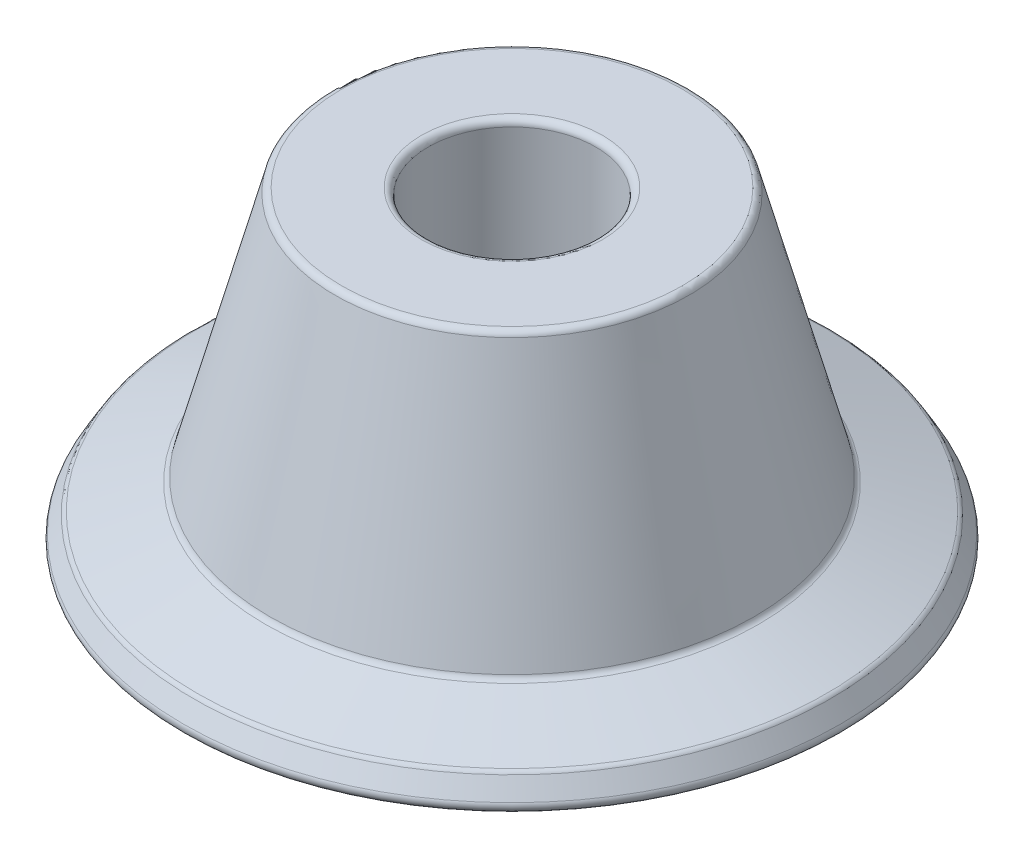
ISO-10303-21;
HEADER;
FILE_DESCRIPTION(('STEP AP214'),'2;1');
FILE_NAME('part.step','',(''),(''),'','','');
FILE_SCHEMA(('AUTOMOTIVE_DESIGN { 1 0 10303 214 1 1 1 1 }'));
ENDSEC;
DATA;
#1=APPLICATION_CONTEXT('core data for automotive mechanical design processes');
#2=APPLICATION_PROTOCOL_DEFINITION('international standard','automotive_design',2000,#1);
#3=PRODUCT_CONTEXT('',#1,'mechanical');
#4=PRODUCT('Part','Part','',(#3));
#5=PRODUCT_RELATED_PRODUCT_CATEGORY('part','',(#4));
#6=PRODUCT_DEFINITION_FORMATION('','',#4);
#7=PRODUCT_DEFINITION_CONTEXT('part definition',#1,'design');
#8=PRODUCT_DEFINITION('design','',#6,#7);
#9=PRODUCT_DEFINITION_SHAPE('','',#8);
#10=(LENGTH_UNIT() NAMED_UNIT(*) SI_UNIT(.MILLI.,.METRE.));
#11=(NAMED_UNIT(*) PLANE_ANGLE_UNIT() SI_UNIT($,.RADIAN.));
#12=(NAMED_UNIT(*) SI_UNIT($,.STERADIAN.) SOLID_ANGLE_UNIT());
#13=UNCERTAINTY_MEASURE_WITH_UNIT(LENGTH_MEASURE(1.E-05),#10,'distance_accuracy_value','');
#14=(GEOMETRIC_REPRESENTATION_CONTEXT(3) GLOBAL_UNCERTAINTY_ASSIGNED_CONTEXT((#13)) GLOBAL_UNIT_ASSIGNED_CONTEXT((#10,
#11,#12)) REPRESENTATION_CONTEXT('',''));
#15=CARTESIAN_POINT('',(0.,0.,0.));
#16=DIRECTION('',(0.,0.,1.));
#17=DIRECTION('',(1.,0.,0.));
#18=AXIS2_PLACEMENT_3D('',#15,#16,#17);
#19=CARTESIAN_POINT('',(0.,-2.56687297664551,0.));
#20=DIRECTION('',(0.,-1.,0.));
#21=DIRECTION('',(0.,0.,-1.));
#22=AXIS2_PLACEMENT_3D('',#19,#20,#21);
#23=CONICAL_SURFACE('',#22,17.9329922306617,0.259688319580683);
#24=CARTESIAN_POINT('',(0.,15.6283896672882,0.));
#25=DIRECTION('',(0.,-1.,0.));
#26=DIRECTION('',(0.,0.,-1.));
#27=AXIS2_PLACEMENT_3D('',#24,#25,#26);
#28=CIRCLE('',#27,13.0987323436966);
#29=CARTESIAN_POINT('',(0.,15.6283896672882,-13.0987323436966));
#30=VERTEX_POINT('',#29);
#31=EDGE_CURVE('E166',#30,#30,#28,.F.);
#32=ORIENTED_EDGE('',*,*,#31,.F.);
#33=EDGE_LOOP('',(#32));
#34=FACE_BOUND('',#33,.T.);
#35=CARTESIAN_POINT('',(0.,-2.56687297664552,0.));
#36=DIRECTION('',(0.,-1.,0.));
#37=DIRECTION('',(0.,0.,-1.));
#38=AXIS2_PLACEMENT_3D('',#35,#36,#37);
#39=CIRCLE('',#38,17.9329922306617);
#40=CARTESIAN_POINT('',(0.,-2.56687297664552,-17.9329922306617));
#41=VERTEX_POINT('',#40);
#42=EDGE_CURVE('E171',#41,#41,#39,.F.);
#43=ORIENTED_EDGE('',*,*,#42,.T.);
#44=EDGE_LOOP('',(#43));
#45=FACE_BOUND('',#44,.T.);
#46=ADVANCED_FACE('F16',(#34,#45),#23,.T.);
#47=CARTESIAN_POINT('',(0.,-2.43848330935731,0.));
#48=DIRECTION('',(0.,-1.,0.));
#49=DIRECTION('',(0.,0.,-1.));
#50=AXIS2_PLACEMENT_3D('',#47,#48,#49);
#51=TOROIDAL_SURFACE('',#50,18.4162272597455,0.5);
#52=ORIENTED_EDGE('',*,*,#42,.F.);
#53=EDGE_LOOP('',(#52));
#54=FACE_BOUND('',#53,.T.);
#55=CARTESIAN_POINT('',(0.,-2.90832961975026,0.));
#56=DIRECTION('',(0.,-1.,0.));
#57=DIRECTION('',(0.,0.,-1.));
#58=AXIS2_PLACEMENT_3D('',#55,#56,#57);
#59=CIRCLE('',#58,18.2452171880826);
#60=CARTESIAN_POINT('',(0.,-2.90832961975026,-18.2452171880826));
#61=VERTEX_POINT('',#60);
#62=EDGE_CURVE('E66',#61,#61,#59,.T.);
#63=ORIENTED_EDGE('',*,*,#62,.F.);
#64=EDGE_LOOP('',(#63));
#65=FACE_BOUND('',#64,.T.);
#66=ADVANCED_FACE('F154',(#54,#65),#51,.F.);
#67=CARTESIAN_POINT('',(0.,15.5,0.));
#68=DIRECTION('',(0.,-1.,0.));
#69=DIRECTION('',(0.,0.,-1.));
#70=AXIS2_PLACEMENT_3D('',#67,#68,#69);
#71=TOROIDAL_SURFACE('',#70,12.6154973146128,0.5);
#72=CARTESIAN_POINT('',(0.,16.,0.));
#73=DIRECTION('',(0.,-1.,0.));
#74=DIRECTION('',(0.,0.,-1.));
#75=AXIS2_PLACEMENT_3D('',#72,#73,#74);
#76=CIRCLE('',#75,12.6154973146128);
#77=CARTESIAN_POINT('',(0.,16.,-12.6154973146128));
#78=VERTEX_POINT('',#77);
#79=CARTESIAN_POINT('',(0.,16.,12.6154973146128));
#80=VERTEX_POINT('',#79);
#81=EDGE_CURVE('E53',#78,#80,#76,.T.);
#82=ORIENTED_EDGE('',*,*,#81,.T.);
#83=CARTESIAN_POINT('',(0.,16.,0.));
#84=DIRECTION('',(0.,-1.,0.));
#85=DIRECTION('',(0.,0.,1.));
#86=AXIS2_PLACEMENT_3D('',#83,#84,#85);
#87=CIRCLE('',#86,12.6154973146128);
#88=EDGE_CURVE('E56',#80,#78,#87,.T.);
#89=ORIENTED_EDGE('',*,*,#88,.T.);
#90=EDGE_LOOP('',(#82,#89));
#91=FACE_BOUND('',#90,.T.);
#92=ORIENTED_EDGE('',*,*,#31,.T.);
#93=EDGE_LOOP('',(#92));
#94=FACE_BOUND('',#93,.T.);
#95=ADVANCED_FACE('F64',(#91,#94),#71,.T.);
#96=CARTESIAN_POINT('',(0.,-4.76321204202719,0.));
#97=DIRECTION('',(0.,-1.,0.));
#98=DIRECTION('',(0.,0.,-1.));
#99=AXIS2_PLACEMENT_3D('',#96,#97,#98);
#100=CONICAL_SURFACE('',#99,23.3414647590318,1.22173047639603);
#101=ORIENTED_EDGE('',*,*,#62,.T.);
#102=EDGE_LOOP('',(#101));
#103=FACE_BOUND('',#102,.T.);
#104=CARTESIAN_POINT('',(0.,-4.76321204202719,0.));
#105=DIRECTION('',(0.,1.,0.));
#106=DIRECTION('',(0.,0.,1.));
#107=AXIS2_PLACEMENT_3D('',#104,#105,#106);
#108=CIRCLE('',#107,23.3414647590318);
#109=CARTESIAN_POINT('',(0.,-4.76321204202719,23.3414647590318));
#110=VERTEX_POINT('',#109);
#111=EDGE_CURVE('E61',#110,#110,#108,.F.);
#112=ORIENTED_EDGE('',*,*,#111,.F.);
#113=EDGE_LOOP('',(#112));
#114=FACE_BOUND('',#113,.T.);
#115=ADVANCED_FACE('F111',(#103,#114),#100,.T.);
#116=CARTESIAN_POINT('',(0.,16.,0.));
#117=DIRECTION('',(0.,-1.,0.));
#118=DIRECTION('',(0.,0.,-1.));
#119=AXIS2_PLACEMENT_3D('',#116,#117,#118);
#120=PLANE('',#119);
#121=CARTESIAN_POINT('',(0.,16.,0.));
#122=DIRECTION('',(0.,1.,0.));
#123=DIRECTION('',(0.,0.,-1.));
#124=AXIS2_PLACEMENT_3D('',#121,#122,#123);
#125=CIRCLE('',#124,6.7);
#126=CARTESIAN_POINT('',(0.,16.,-6.7));
#127=VERTEX_POINT('',#126);
#128=CARTESIAN_POINT('',(0.,16.,6.7));
#129=VERTEX_POINT('',#128);
#130=EDGE_CURVE('E149',#127,#129,#125,.T.);
#131=ORIENTED_EDGE('',*,*,#130,.F.);
#132=CARTESIAN_POINT('',(0.,16.,0.));
#133=DIRECTION('',(0.,1.,0.));
#134=DIRECTION('',(0.,0.,1.));
#135=AXIS2_PLACEMENT_3D('',#132,#133,#134);
#136=CIRCLE('',#135,6.7);
#137=EDGE_CURVE('E99',#129,#127,#136,.T.);
#138=ORIENTED_EDGE('',*,*,#137,.F.);
#139=EDGE_LOOP('',(#131,#138));
#140=FACE_BOUND('',#139,.T.);
#141=ORIENTED_EDGE('',*,*,#81,.F.);
#142=ORIENTED_EDGE('',*,*,#88,.F.);
#143=EDGE_LOOP('',(#141,#142));
#144=FACE_BOUND('',#143,.T.);
#145=ADVANCED_FACE('F58',(#140,#144),#120,.F.);
#146=CARTESIAN_POINT('',(0.,-5.23305835242014,0.));
#147=DIRECTION('',(0.,1.,0.));
#148=DIRECTION('',(0.,0.,1.));
#149=AXIS2_PLACEMENT_3D('',#146,#147,#148);
#150=TOROIDAL_SURFACE('',#149,23.1704546873689,0.5);
#151=CARTESIAN_POINT('',(0.,-4.98305835242015,0.));
#152=DIRECTION('',(0.,-1.,0.));
#153=DIRECTION('',(0.,0.,-1.));
#154=AXIS2_PLACEMENT_3D('',#151,#152,#153);
#155=CIRCLE('',#154,23.6034673892611);
#156=CARTESIAN_POINT('',(0.,-4.98305835242015,-23.6034673892611));
#157=VERTEX_POINT('',#156);
#158=EDGE_CURVE('E97',#157,#157,#155,.T.);
#159=ORIENTED_EDGE('',*,*,#158,.F.);
#160=EDGE_LOOP('',(#159));
#161=FACE_BOUND('',#160,.T.);
#162=ORIENTED_EDGE('',*,*,#111,.T.);
#163=EDGE_LOOP('',(#162));
#164=FACE_BOUND('',#163,.T.);
#165=ADVANCED_FACE('F85',(#161,#164),#150,.T.);
#166=CARTESIAN_POINT('',(0.,15.5,0.));
#167=DIRECTION('',(0.,-1.,0.));
#168=DIRECTION('',(0.,0.,-1.));
#169=AXIS2_PLACEMENT_3D('',#166,#167,#168);
#170=TOROIDAL_SURFACE('',#169,6.7,0.5);
#171=ORIENTED_EDGE('',*,*,#130,.T.);
#172=ORIENTED_EDGE('',*,*,#137,.T.);
#173=EDGE_LOOP('',(#171,#172));
#174=FACE_BOUND('',#173,.T.);
#175=CARTESIAN_POINT('',(0.,15.5,0.));
#176=DIRECTION('',(0.,1.,0.));
#177=DIRECTION('',(0.,0.,1.));
#178=AXIS2_PLACEMENT_3D('',#175,#176,#177);
#179=CIRCLE('',#178,6.2);
#180=CARTESIAN_POINT('',(0.,15.5,6.2));
#181=VERTEX_POINT('',#180);
#182=EDGE_CURVE('E95',#181,#181,#179,.F.);
#183=ORIENTED_EDGE('',*,*,#182,.T.);
#184=EDGE_LOOP('',(#183));
#185=FACE_BOUND('',#184,.T.);
#186=ADVANCED_FACE('F73',(#174,#185),#170,.T.);
#187=CARTESIAN_POINT('',(0.,-6.25000000000001,0.));
#188=DIRECTION('',(0.,-1.,0.));
#189=DIRECTION('',(0.,0.,-1.));
#190=AXIS2_PLACEMENT_3D('',#187,#188,#189);
#191=CONICAL_SURFACE('',#190,24.3349364905389,0.523598775598294);
#192=ORIENTED_EDGE('',*,*,#158,.T.);
#193=EDGE_LOOP('',(#192));
#194=FACE_BOUND('',#193,.T.);
#195=CARTESIAN_POINT('',(0.,-6.25000000000002,0.));
#196=DIRECTION('',(0.,1.,0.));
#197=DIRECTION('',(0.,0.,1.));
#198=AXIS2_PLACEMENT_3D('',#195,#196,#197);
#199=CIRCLE('',#198,24.3349364905389);
#200=CARTESIAN_POINT('',(0.,-6.25000000000002,24.3349364905389));
#201=VERTEX_POINT('',#200);
#202=EDGE_CURVE('E228',#201,#201,#199,.F.);
#203=ORIENTED_EDGE('',*,*,#202,.F.);
#204=EDGE_LOOP('',(#203));
#205=FACE_BOUND('',#204,.T.);
#206=ADVANCED_FACE('F84',(#194,#205),#191,.T.);
#207=CARTESIAN_POINT('',(0.,-7.00000000000001,0.));
#208=DIRECTION('',(0.,1.,0.));
#209=DIRECTION('',(0.,0.,1.));
#210=AXIS2_PLACEMENT_3D('',#207,#208,#209);
#211=CYLINDRICAL_SURFACE('',#210,6.2);
#212=CARTESIAN_POINT('',(0.,-6.50000000000001,0.));
#213=DIRECTION('',(0.,1.,0.));
#214=DIRECTION('',(0.,0.,1.));
#215=AXIS2_PLACEMENT_3D('',#212,#213,#214);
#216=CIRCLE('',#215,6.2);
#217=CARTESIAN_POINT('',(0.,-6.50000000000001,6.2));
#218=VERTEX_POINT('',#217);
#219=EDGE_CURVE('E220',#218,#218,#216,.T.);
#220=ORIENTED_EDGE('',*,*,#219,.F.);
#221=EDGE_LOOP('',(#220));
#222=FACE_BOUND('',#221,.T.);
#223=ORIENTED_EDGE('',*,*,#182,.F.);
#224=EDGE_LOOP('',(#223));
#225=FACE_BOUND('',#224,.T.);
#226=ADVANCED_FACE('F236',(#222,#225),#211,.F.);
#227=CARTESIAN_POINT('',(0.,-6.50000000000001,0.));
#228=DIRECTION('',(0.,1.,0.));
#229=DIRECTION('',(0.,0.,1.));
#230=AXIS2_PLACEMENT_3D('',#227,#228,#229);
#231=TOROIDAL_SURFACE('',#230,23.9019237886467,0.5);
#232=CARTESIAN_POINT('',(0.,-7.00000000000001,0.));
#233=DIRECTION('',(0.,1.,0.));
#234=DIRECTION('',(0.,0.,1.));
#235=AXIS2_PLACEMENT_3D('',#232,#233,#234);
#236=CIRCLE('',#235,23.9019237886467);
#237=CARTESIAN_POINT('',(0.,-7.00000000000001,23.9019237886467));
#238=VERTEX_POINT('',#237);
#239=CARTESIAN_POINT('',(0.,-7.00000000000001,-23.9019237886467));
#240=VERTEX_POINT('',#239);
#241=EDGE_CURVE('E227',#238,#240,#236,.T.);
#242=ORIENTED_EDGE('',*,*,#241,.T.);
#243=CARTESIAN_POINT('',(0.,-7.00000000000001,0.));
#244=DIRECTION('',(0.,1.,0.));
#245=DIRECTION('',(0.,0.,-1.));
#246=AXIS2_PLACEMENT_3D('',#243,#244,#245);
#247=CIRCLE('',#246,23.9019237886467);
#248=EDGE_CURVE('E216',#240,#238,#247,.T.);
#249=ORIENTED_EDGE('',*,*,#248,.T.);
#250=EDGE_LOOP('',(#242,#249));
#251=FACE_BOUND('',#250,.T.);
#252=ORIENTED_EDGE('',*,*,#202,.T.);
#253=EDGE_LOOP('',(#252));
#254=FACE_BOUND('',#253,.T.);
#255=ADVANCED_FACE('F193',(#251,#254),#231,.T.);
#256=CARTESIAN_POINT('',(0.,-6.50000000000001,0.));
#257=DIRECTION('',(0.,1.,0.));
#258=DIRECTION('',(0.,0.,1.));
#259=AXIS2_PLACEMENT_3D('',#256,#257,#258);
#260=TOROIDAL_SURFACE('',#259,6.7,0.5);
#261=CARTESIAN_POINT('',(0.,-7.00000000000001,0.));
#262=DIRECTION('',(0.,-1.,0.));
#263=DIRECTION('',(0.,0.,1.));
#264=AXIS2_PLACEMENT_3D('',#261,#262,#263);
#265=CIRCLE('',#264,6.7);
#266=CARTESIAN_POINT('',(0.,-7.00000000000001,6.7));
#267=VERTEX_POINT('',#266);
#268=CARTESIAN_POINT('',(0.,-7.00000000000001,-6.7));
#269=VERTEX_POINT('',#268);
#270=EDGE_CURVE('E27',#267,#269,#265,.T.);
#271=ORIENTED_EDGE('',*,*,#270,.T.);
#272=CARTESIAN_POINT('',(0.,-7.00000000000001,0.));
#273=DIRECTION('',(0.,-1.,0.));
#274=DIRECTION('',(0.,0.,-1.));
#275=AXIS2_PLACEMENT_3D('',#272,#273,#274);
#276=CIRCLE('',#275,6.7);
#277=EDGE_CURVE('E11',#269,#267,#276,.T.);
#278=ORIENTED_EDGE('',*,*,#277,.T.);
#279=EDGE_LOOP('',(#271,#278));
#280=FACE_BOUND('',#279,.T.);
#281=ORIENTED_EDGE('',*,*,#219,.T.);
#282=EDGE_LOOP('',(#281));
#283=FACE_BOUND('',#282,.T.);
#284=ADVANCED_FACE('F181',(#280,#283),#260,.T.);
#285=CARTESIAN_POINT('',(-24.7679491924311,-7.00000000000001,0.));
#286=DIRECTION('',(0.,1.,0.));
#287=DIRECTION('',(0.,0.,1.));
#288=AXIS2_PLACEMENT_3D('',#285,#286,#287);
#289=PLANE('',#288);
#290=ORIENTED_EDGE('',*,*,#270,.F.);
#291=ORIENTED_EDGE('',*,*,#277,.F.);
#292=EDGE_LOOP('',(#290,#291));
#293=FACE_BOUND('',#292,.T.);
#294=ORIENTED_EDGE('',*,*,#241,.F.);
#295=ORIENTED_EDGE('',*,*,#248,.F.);
#296=EDGE_LOOP('',(#294,#295));
#297=FACE_BOUND('',#296,.T.);
#298=ADVANCED_FACE('F192',(#293,#297),#289,.F.);
#299=CLOSED_SHELL('',(#46,#66,#95,#115,#145,#165,#186,#206,#226,#255,#284,#298));
#300=MANIFOLD_SOLID_BREP('B1',#299);
#301=ADVANCED_BREP_SHAPE_REPRESENTATION('',(#18,#300),#14);
#302=SHAPE_DEFINITION_REPRESENTATION(#9,#301);
ENDSEC;
END-ISO-10303-21;
